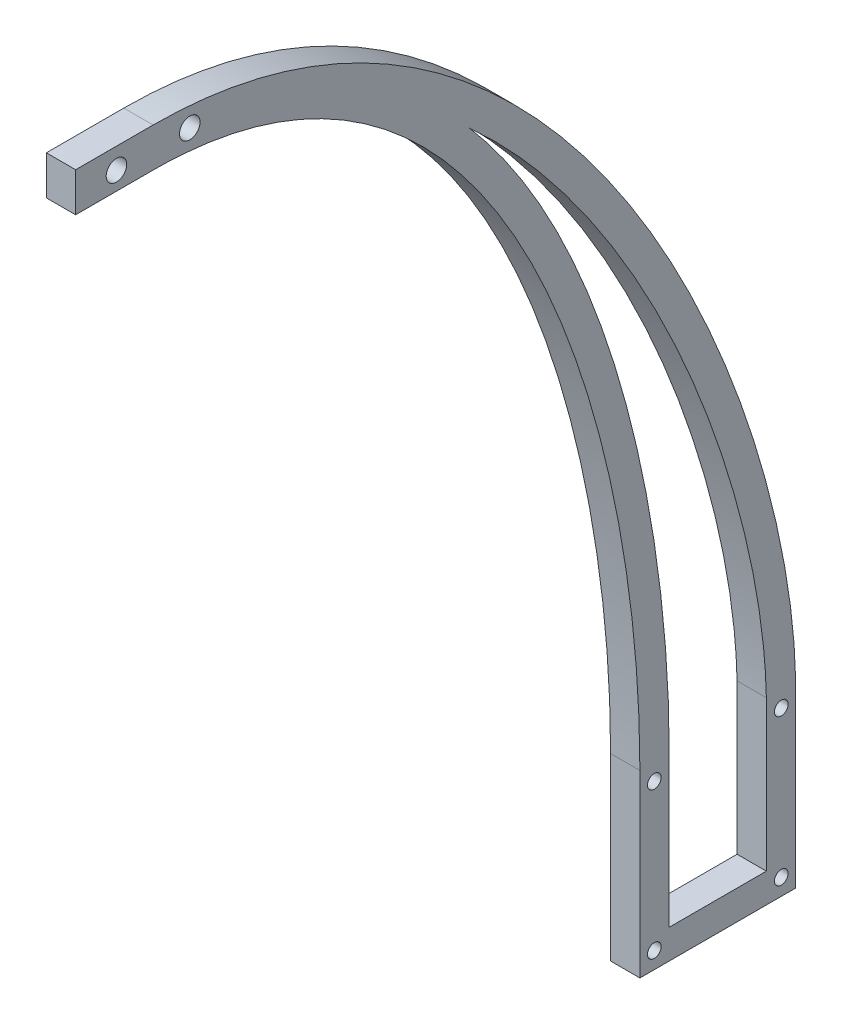
ISO-10303-21;
HEADER;
FILE_DESCRIPTION(('STEP AP214'),'2;1');
FILE_NAME('part.step','',(''),(''),'','','');
FILE_SCHEMA(('AUTOMOTIVE_DESIGN { 1 0 10303 214 1 1 1 1 }'));
ENDSEC;
DATA;
#1=APPLICATION_CONTEXT('core data for automotive mechanical design processes');
#2=APPLICATION_PROTOCOL_DEFINITION('international standard','automotive_design',2000,#1);
#3=PRODUCT_CONTEXT('',#1,'mechanical');
#4=PRODUCT('Part','Part','',(#3));
#5=PRODUCT_RELATED_PRODUCT_CATEGORY('part','',(#4));
#6=PRODUCT_DEFINITION_FORMATION('','',#4);
#7=PRODUCT_DEFINITION_CONTEXT('part definition',#1,'design');
#8=PRODUCT_DEFINITION('design','',#6,#7);
#9=PRODUCT_DEFINITION_SHAPE('','',#8);
#10=(LENGTH_UNIT() NAMED_UNIT(*) SI_UNIT(.MILLI.,.METRE.));
#11=(NAMED_UNIT(*) PLANE_ANGLE_UNIT() SI_UNIT($,.RADIAN.));
#12=(NAMED_UNIT(*) SI_UNIT($,.STERADIAN.) SOLID_ANGLE_UNIT());
#13=UNCERTAINTY_MEASURE_WITH_UNIT(LENGTH_MEASURE(1.E-05),#10,'distance_accuracy_value','');
#14=(GEOMETRIC_REPRESENTATION_CONTEXT(3) GLOBAL_UNCERTAINTY_ASSIGNED_CONTEXT((#13)) GLOBAL_UNIT_ASSIGNED_CONTEXT((#10,
#11,#12)) REPRESENTATION_CONTEXT('',''));
#15=CARTESIAN_POINT('',(0.,0.,0.));
#16=DIRECTION('',(0.,0.,1.));
#17=DIRECTION('',(1.,0.,0.));
#18=AXIS2_PLACEMENT_3D('',#15,#16,#17);
#19=CARTESIAN_POINT('',(-31.,-74.6026285586912,0.));
#20=DIRECTION('',(0.,-1.,0.));
#21=DIRECTION('',(0.,0.,-1.));
#22=AXIS2_PLACEMENT_3D('',#19,#20,#21);
#23=PLANE('',#22);
#24=DIRECTION('',(0.,0.,-1.));
#25=VECTOR('',#24,1.);
#26=CARTESIAN_POINT('',(-25.,-74.6026285586912,0.));
#27=LINE('',#26,#25);
#28=CARTESIAN_POINT('',(-25.,-74.6026285586912,-99.6764669802417));
#29=VERTEX_POINT('',#28);
#30=CARTESIAN_POINT('',(-25.,-74.6026285586912,-131.570211562689));
#31=VERTEX_POINT('',#30);
#32=EDGE_CURVE('E256',#29,#31,#27,.T.);
#33=ORIENTED_EDGE('',*,*,#32,.F.);
#34=DIRECTION('',(1.,0.,0.));
#35=VECTOR('',#34,1.);
#36=CARTESIAN_POINT('',(-31.,-74.6026285586912,-99.6764669802417));
#37=LINE('',#36,#35);
#38=CARTESIAN_POINT('',(-31.,-74.6026285586912,-99.6764669802417));
#39=VERTEX_POINT('',#38);
#40=EDGE_CURVE('E11',#39,#29,#37,.T.);
#41=ORIENTED_EDGE('',*,*,#40,.F.);
#42=DIRECTION('',(0.,0.,-1.));
#43=VECTOR('',#42,1.);
#44=CARTESIAN_POINT('',(-31.,-74.6026285586912,0.));
#45=LINE('',#44,#43);
#46=CARTESIAN_POINT('',(-31.,-74.6026285586912,-131.570211562689));
#47=VERTEX_POINT('',#46);
#48=EDGE_CURVE('E329',#39,#47,#45,.T.);
#49=ORIENTED_EDGE('',*,*,#48,.T.);
#50=DIRECTION('',(1.,0.,0.));
#51=VECTOR('',#50,1.);
#52=CARTESIAN_POINT('',(-31.,-74.6026285586912,-131.570211562689));
#53=LINE('',#52,#51);
#54=EDGE_CURVE('E244',#47,#31,#53,.T.);
#55=ORIENTED_EDGE('',*,*,#54,.T.);
#56=EDGE_LOOP('',(#33,#41,#49,#55));
#57=FACE_BOUND('',#56,.T.);
#58=ADVANCED_FACE('F34',(#57),#23,.T.);
#59=CARTESIAN_POINT('',(-31.,0.,-99.6764669802417));
#60=DIRECTION('',(0.,0.,-1.));
#61=DIRECTION('',(-1.,0.,0.));
#62=AXIS2_PLACEMENT_3D('',#59,#60,#61);
#63=PLANE('',#62);
#64=DIRECTION('',(0.,1.,0.));
#65=VECTOR('',#64,1.);
#66=CARTESIAN_POINT('',(-25.,0.,-99.6764669802417));
#67=LINE('',#66,#65);
#68=CARTESIAN_POINT('',(-25.,-37.8021540404827,-99.6764669802417));
#69=VERTEX_POINT('',#68);
#70=EDGE_CURVE('E259',#29,#69,#67,.T.);
#71=ORIENTED_EDGE('',*,*,#70,.T.);
#72=DIRECTION('',(1.,0.,0.));
#73=VECTOR('',#72,1.);
#74=CARTESIAN_POINT('',(-31.,-37.8021540404827,-99.6764669802417));
#75=LINE('',#74,#73);
#76=CARTESIAN_POINT('',(-31.,-37.8021540404827,-99.6764669802417));
#77=VERTEX_POINT('',#76);
#78=EDGE_CURVE('E45',#77,#69,#75,.T.);
#79=ORIENTED_EDGE('',*,*,#78,.F.);
#80=DIRECTION('',(0.,1.,0.));
#81=VECTOR('',#80,1.);
#82=CARTESIAN_POINT('',(-31.,0.,-99.6764669802417));
#83=LINE('',#82,#81);
#84=EDGE_CURVE('E350',#39,#77,#83,.T.);
#85=ORIENTED_EDGE('',*,*,#84,.F.);
#86=ORIENTED_EDGE('',*,*,#40,.T.);
#87=EDGE_LOOP('',(#71,#79,#85,#86));
#88=FACE_BOUND('',#87,.T.);
#89=ADVANCED_FACE('F320',(#88),#63,.F.);
#90=CARTESIAN_POINT('',(-31.,-37.8021540404827,-99.6764669802417));
#91=CARTESIAN_POINT('',(-31.,25.8867501246922,-99.6764669802417));
#92=CARTESIAN_POINT('',(-31.,118.5,-72.3910283919676));
#93=CARTESIAN_POINT('',(-31.,118.5,0.));
#94=B_SPLINE_CURVE_WITH_KNOTS('',3,(#90,#91,#92,#93),.UNSPECIFIED.,.F.,.F.,(4,4),(0.,1.),.UNSPECIFIED.);
#95=DIRECTION('',(1.,0.,0.));
#96=VECTOR('',#95,1.);
#97=SURFACE_OF_LINEAR_EXTRUSION('',#94,#96);
#98=CARTESIAN_POINT('',(-25.,-37.8021540404827,-99.6764669802417));
#99=CARTESIAN_POINT('',(-25.,25.8867501246922,-99.6764669802417));
#100=CARTESIAN_POINT('',(-25.,118.5,-72.3910283919676));
#101=CARTESIAN_POINT('',(-25.,118.5,0.));
#102=B_SPLINE_CURVE_WITH_KNOTS('',3,(#98,#99,#100,#101),.UNSPECIFIED.,.F.,.F.,(4,4),(0.,1.),.UNSPECIFIED.);
#103=CARTESIAN_POINT('',(-25.,118.5,0.));
#104=VERTEX_POINT('',#103);
#105=EDGE_CURVE('E262',#69,#104,#102,.T.);
#106=ORIENTED_EDGE('',*,*,#105,.T.);
#107=DIRECTION('',(1.,0.,0.));
#108=VECTOR('',#107,1.);
#109=CARTESIAN_POINT('',(-31.,118.5,0.));
#110=LINE('',#109,#108);
#111=CARTESIAN_POINT('',(-31.,118.5,0.));
#112=VERTEX_POINT('',#111);
#113=EDGE_CURVE('E306',#112,#104,#110,.T.);
#114=ORIENTED_EDGE('',*,*,#113,.F.);
#115=EDGE_CURVE('E315',#77,#112,#94,.T.);
#116=ORIENTED_EDGE('',*,*,#115,.F.);
#117=ORIENTED_EDGE('',*,*,#78,.T.);
#118=EDGE_LOOP('',(#106,#114,#116,#117));
#119=FACE_BOUND('',#118,.T.);
#120=ADVANCED_FACE('F312',(#119),#97,.F.);
#121=CARTESIAN_POINT('',(-31.,118.5,0.));
#122=DIRECTION('',(0.,1.,0.));
#123=DIRECTION('',(0.,0.,1.));
#124=AXIS2_PLACEMENT_3D('',#121,#122,#123);
#125=PLANE('',#124);
#126=DIRECTION('',(0.,0.,1.));
#127=VECTOR('',#126,1.);
#128=CARTESIAN_POINT('',(-25.,118.5,0.));
#129=LINE('',#128,#127);
#130=CARTESIAN_POINT('',(-25.,118.5,15.8665640867256));
#131=VERTEX_POINT('',#130);
#132=EDGE_CURVE('E267',#104,#131,#129,.T.);
#133=ORIENTED_EDGE('',*,*,#132,.T.);
#134=DIRECTION('',(1.,0.,0.));
#135=VECTOR('',#134,1.);
#136=CARTESIAN_POINT('',(-31.,118.5,15.8665640867256));
#137=LINE('',#136,#135);
#138=CARTESIAN_POINT('',(-31.,118.5,15.8665640867256));
#139=VERTEX_POINT('',#138);
#140=EDGE_CURVE('E304',#139,#131,#137,.T.);
#141=ORIENTED_EDGE('',*,*,#140,.F.);
#142=DIRECTION('',(0.,0.,1.));
#143=VECTOR('',#142,1.);
#144=CARTESIAN_POINT('',(-31.,118.5,0.));
#145=LINE('',#144,#143);
#146=EDGE_CURVE('E346',#112,#139,#145,.T.);
#147=ORIENTED_EDGE('',*,*,#146,.F.);
#148=ORIENTED_EDGE('',*,*,#113,.T.);
#149=EDGE_LOOP('',(#133,#141,#147,#148));
#150=FACE_BOUND('',#149,.T.);
#151=ADVANCED_FACE('F345',(#150),#125,.F.);
#152=CARTESIAN_POINT('',(-31.,0.,15.8665640867257));
#153=DIRECTION('',(0.,0.,1.));
#154=DIRECTION('',(0.,-1.,0.));
#155=AXIS2_PLACEMENT_3D('',#152,#153,#154);
#156=PLANE('',#155);
#157=DIRECTION('',(0.,-1.,0.));
#158=VECTOR('',#157,1.);
#159=CARTESIAN_POINT('',(-25.,0.,15.8665640867257));
#160=LINE('',#159,#158);
#161=CARTESIAN_POINT('',(-25.,126.5,15.8665640867256));
#162=VERTEX_POINT('',#161);
#163=EDGE_CURVE('E273',#162,#131,#160,.T.);
#164=ORIENTED_EDGE('',*,*,#163,.F.);
#165=DIRECTION('',(1.,0.,0.));
#166=VECTOR('',#165,1.);
#167=CARTESIAN_POINT('',(-31.,126.5,15.8665640867256));
#168=LINE('',#167,#166);
#169=CARTESIAN_POINT('',(-31.,126.5,15.8665640867256));
#170=VERTEX_POINT('',#169);
#171=EDGE_CURVE('E302',#170,#162,#168,.T.);
#172=ORIENTED_EDGE('',*,*,#171,.F.);
#173=DIRECTION('',(0.,-1.,0.));
#174=VECTOR('',#173,1.);
#175=CARTESIAN_POINT('',(-31.,0.,15.8665640867257));
#176=LINE('',#175,#174);
#177=EDGE_CURVE('E343',#170,#139,#176,.T.);
#178=ORIENTED_EDGE('',*,*,#177,.T.);
#179=ORIENTED_EDGE('',*,*,#140,.T.);
#180=EDGE_LOOP('',(#164,#172,#178,#179));
#181=FACE_BOUND('',#180,.T.);
#182=ADVANCED_FACE('F339',(#181),#156,.T.);
#183=CARTESIAN_POINT('',(-31.,126.5,0.));
#184=DIRECTION('',(0.,1.,0.));
#185=DIRECTION('',(0.,0.,1.));
#186=AXIS2_PLACEMENT_3D('',#183,#184,#185);
#187=PLANE('',#186);
#188=DIRECTION('',(0.,0.,1.));
#189=VECTOR('',#188,1.);
#190=CARTESIAN_POINT('',(-25.,126.5,0.));
#191=LINE('',#190,#189);
#192=CARTESIAN_POINT('',(-25.,126.5,0.));
#193=VERTEX_POINT('',#192);
#194=EDGE_CURVE('E276',#193,#162,#191,.T.);
#195=ORIENTED_EDGE('',*,*,#194,.F.);
#196=DIRECTION('',(1.,0.,0.));
#197=VECTOR('',#196,1.);
#198=CARTESIAN_POINT('',(-31.,126.5,0.));
#199=LINE('',#198,#197);
#200=CARTESIAN_POINT('',(-31.,126.5,0.));
#201=VERTEX_POINT('',#200);
#202=EDGE_CURVE('E300',#201,#193,#199,.T.);
#203=ORIENTED_EDGE('',*,*,#202,.F.);
#204=DIRECTION('',(0.,0.,1.));
#205=VECTOR('',#204,1.);
#206=CARTESIAN_POINT('',(-31.,126.5,0.));
#207=LINE('',#206,#205);
#208=EDGE_CURVE('E232',#201,#170,#207,.T.);
#209=ORIENTED_EDGE('',*,*,#208,.T.);
#210=ORIENTED_EDGE('',*,*,#171,.T.);
#211=EDGE_LOOP('',(#195,#203,#209,#210));
#212=FACE_BOUND('',#211,.T.);
#213=ADVANCED_FACE('F221',(#212),#187,.T.);
#214=CARTESIAN_POINT('',(-31.,-37.8021540404827,-131.570211562689));
#215=CARTESIAN_POINT('',(-31.,18.488598382336,-130.468226092805));
#216=CARTESIAN_POINT('',(-31.,126.5,-82.518343245907));
#217=CARTESIAN_POINT('',(-31.,126.5,0.));
#218=B_SPLINE_CURVE_WITH_KNOTS('',3,(#214,#215,#216,#217),.UNSPECIFIED.,.F.,.F.,(4,4),(0.,1.),.UNSPECIFIED.);
#219=DIRECTION('',(1.,0.,0.));
#220=VECTOR('',#219,1.);
#221=SURFACE_OF_LINEAR_EXTRUSION('',#218,#220);
#222=CARTESIAN_POINT('',(-25.,-37.8021540404827,-131.570211562689));
#223=CARTESIAN_POINT('',(-25.,18.488598382336,-130.468226092805));
#224=CARTESIAN_POINT('',(-25.,126.5,-82.518343245907));
#225=CARTESIAN_POINT('',(-25.,126.5,0.));
#226=B_SPLINE_CURVE_WITH_KNOTS('',3,(#222,#223,#224,#225),.UNSPECIFIED.,.F.,.F.,(4,4),(0.,1.),.UNSPECIFIED.);
#227=CARTESIAN_POINT('',(-25.,-37.8021540404827,-131.570211562689));
#228=VERTEX_POINT('',#227);
#229=EDGE_CURVE('E279',#228,#193,#226,.T.);
#230=ORIENTED_EDGE('',*,*,#229,.F.);
#231=DIRECTION('',(1.,0.,0.));
#232=VECTOR('',#231,1.);
#233=CARTESIAN_POINT('',(-31.,-37.8021540404827,-131.570211562689));
#234=LINE('',#233,#232);
#235=CARTESIAN_POINT('',(-31.,-37.8021540404827,-131.570211562689));
#236=VERTEX_POINT('',#235);
#237=EDGE_CURVE('E298',#236,#228,#234,.T.);
#238=ORIENTED_EDGE('',*,*,#237,.F.);
#239=EDGE_CURVE('E224',#236,#201,#218,.T.);
#240=ORIENTED_EDGE('',*,*,#239,.T.);
#241=ORIENTED_EDGE('',*,*,#202,.T.);
#242=EDGE_LOOP('',(#230,#238,#240,#241));
#243=FACE_BOUND('',#242,.T.);
#244=ADVANCED_FACE('F212',(#243),#221,.T.);
#245=CARTESIAN_POINT('',(-31.,122.225596062464,-7.50848665157555));
#246=DIRECTION('',(1.,0.,0.));
#247=DIRECTION('',(0.,0.,-1.));
#248=AXIS2_PLACEMENT_3D('',#245,#246,#247);
#249=CYLINDRICAL_SURFACE('',#248,2.09999999999999);
#250=CARTESIAN_POINT('',(-31.,122.225596062464,-7.50848665157555));
#251=DIRECTION('',(-1.,0.,0.));
#252=DIRECTION('',(0.,0.,1.));
#253=AXIS2_PLACEMENT_3D('',#250,#251,#252);
#254=CIRCLE('',#253,2.09999999999999);
#255=CARTESIAN_POINT('',(-31.,122.225596062464,-5.40848665157556));
#256=VERTEX_POINT('',#255);
#257=EDGE_CURVE('E238',#256,#256,#254,.T.);
#258=ORIENTED_EDGE('',*,*,#257,.T.);
#259=EDGE_LOOP('',(#258));
#260=FACE_BOUND('',#259,.T.);
#261=CARTESIAN_POINT('',(-25.,122.225596062464,-7.50848665157555));
#262=DIRECTION('',(-1.,0.,0.));
#263=DIRECTION('',(0.,0.,1.));
#264=AXIS2_PLACEMENT_3D('',#261,#262,#263);
#265=CIRCLE('',#264,2.09999999999999);
#266=CARTESIAN_POINT('',(-25.,122.225596062464,-5.40848665157556));
#267=VERTEX_POINT('',#266);
#268=EDGE_CURVE('E290',#267,#267,#265,.T.);
#269=ORIENTED_EDGE('',*,*,#268,.F.);
#270=EDGE_LOOP('',(#269));
#271=FACE_BOUND('',#270,.T.);
#272=ADVANCED_FACE('F208',(#260,#271),#249,.F.);
#273=CARTESIAN_POINT('',(-31.,0.,-131.570211562689));
#274=DIRECTION('',(0.,0.,1.));
#275=DIRECTION('',(1.,0.,0.));
#276=AXIS2_PLACEMENT_3D('',#273,#274,#275);
#277=PLANE('',#276);
#278=DIRECTION('',(0.,-1.,0.));
#279=VECTOR('',#278,1.);
#280=CARTESIAN_POINT('',(-25.,0.,-131.570211562689));
#281=LINE('',#280,#279);
#282=EDGE_CURVE('E284',#228,#31,#281,.T.);
#283=ORIENTED_EDGE('',*,*,#282,.T.);
#284=ORIENTED_EDGE('',*,*,#54,.F.);
#285=DIRECTION('',(0.,-1.,0.));
#286=VECTOR('',#285,1.);
#287=CARTESIAN_POINT('',(-31.,0.,-131.570211562689));
#288=LINE('',#287,#286);
#289=EDGE_CURVE('E231',#236,#47,#288,.T.);
#290=ORIENTED_EDGE('',*,*,#289,.F.);
#291=ORIENTED_EDGE('',*,*,#237,.T.);
#292=EDGE_LOOP('',(#283,#284,#290,#291));
#293=FACE_BOUND('',#292,.T.);
#294=ADVANCED_FACE('F211',(#293),#277,.F.);
#295=CARTESIAN_POINT('',(-31.,-41.2023912995869,-128.623339271465));
#296=DIRECTION('',(1.,0.,0.));
#297=DIRECTION('',(0.,0.,-1.));
#298=AXIS2_PLACEMENT_3D('',#295,#296,#297);
#299=CYLINDRICAL_SURFACE('',#298,1.4);
#300=CARTESIAN_POINT('',(-31.,-41.2023912995869,-128.623339271465));
#301=DIRECTION('',(-1.,0.,0.));
#302=DIRECTION('',(0.,0.,1.));
#303=AXIS2_PLACEMENT_3D('',#300,#301,#302);
#304=CIRCLE('',#303,1.4);
#305=CARTESIAN_POINT('',(-31.,-41.2023912995869,-127.223339271465));
#306=VERTEX_POINT('',#305);
#307=EDGE_CURVE('E397',#306,#306,#304,.F.);
#308=ORIENTED_EDGE('',*,*,#307,.F.);
#309=EDGE_LOOP('',(#308));
#310=FACE_BOUND('',#309,.T.);
#311=CARTESIAN_POINT('',(-25.,-41.2023912995869,-128.623339271465));
#312=DIRECTION('',(-1.,0.,0.));
#313=DIRECTION('',(0.,0.,1.));
#314=AXIS2_PLACEMENT_3D('',#311,#312,#313);
#315=CIRCLE('',#314,1.4);
#316=CARTESIAN_POINT('',(-25.,-41.2023912995869,-127.223339271465));
#317=VERTEX_POINT('',#316);
#318=EDGE_CURVE('E253',#317,#317,#315,.F.);
#319=ORIENTED_EDGE('',*,*,#318,.T.);
#320=EDGE_LOOP('',(#319));
#321=FACE_BOUND('',#320,.T.);
#322=ADVANCED_FACE('F216',(#310,#321),#299,.F.);
#323=CARTESIAN_POINT('',(-31.,-41.2023912995869,-102.623339271465));
#324=DIRECTION('',(1.,0.,0.));
#325=DIRECTION('',(0.,0.,-1.));
#326=AXIS2_PLACEMENT_3D('',#323,#324,#325);
#327=CYLINDRICAL_SURFACE('',#326,1.4);
#328=CARTESIAN_POINT('',(-31.,-41.2023912995869,-102.623339271465));
#329=DIRECTION('',(-1.,0.,0.));
#330=DIRECTION('',(0.,0.,1.));
#331=AXIS2_PLACEMENT_3D('',#328,#329,#330);
#332=CIRCLE('',#331,1.4);
#333=CARTESIAN_POINT('',(-31.,-41.2023912995869,-101.223339271465));
#334=VERTEX_POINT('',#333);
#335=EDGE_CURVE('E394',#334,#334,#332,.F.);
#336=ORIENTED_EDGE('',*,*,#335,.F.);
#337=EDGE_LOOP('',(#336));
#338=FACE_BOUND('',#337,.T.);
#339=CARTESIAN_POINT('',(-25.,-41.2023912995869,-102.623339271465));
#340=DIRECTION('',(-1.,0.,0.));
#341=DIRECTION('',(0.,0.,1.));
#342=AXIS2_PLACEMENT_3D('',#339,#340,#341);
#343=CIRCLE('',#342,1.4);
#344=CARTESIAN_POINT('',(-25.,-41.2023912995869,-101.223339271465));
#345=VERTEX_POINT('',#344);
#346=EDGE_CURVE('E250',#345,#345,#343,.F.);
#347=ORIENTED_EDGE('',*,*,#346,.T.);
#348=EDGE_LOOP('',(#347));
#349=FACE_BOUND('',#348,.T.);
#350=ADVANCED_FACE('F370',(#338,#349),#327,.F.);
#351=CARTESIAN_POINT('',(-31.,-71.2023912995869,-102.623339271465));
#352=DIRECTION('',(1.,0.,0.));
#353=DIRECTION('',(0.,0.,-1.));
#354=AXIS2_PLACEMENT_3D('',#351,#352,#353);
#355=CYLINDRICAL_SURFACE('',#354,1.4);
#356=CARTESIAN_POINT('',(-31.,-71.2023912995869,-102.623339271465));
#357=DIRECTION('',(-1.,0.,0.));
#358=DIRECTION('',(0.,0.,1.));
#359=AXIS2_PLACEMENT_3D('',#356,#357,#358);
#360=CIRCLE('',#359,1.4);
#361=CARTESIAN_POINT('',(-31.,-71.2023912995869,-101.223339271465));
#362=VERTEX_POINT('',#361);
#363=EDGE_CURVE('E384',#362,#362,#360,.F.);
#364=ORIENTED_EDGE('',*,*,#363,.F.);
#365=EDGE_LOOP('',(#364));
#366=FACE_BOUND('',#365,.T.);
#367=CARTESIAN_POINT('',(-25.,-71.2023912995869,-102.623339271465));
#368=DIRECTION('',(-1.,0.,0.));
#369=DIRECTION('',(0.,0.,1.));
#370=AXIS2_PLACEMENT_3D('',#367,#368,#369);
#371=CIRCLE('',#370,1.4);
#372=CARTESIAN_POINT('',(-25.,-71.2023912995869,-101.223339271465));
#373=VERTEX_POINT('',#372);
#374=EDGE_CURVE('E247',#373,#373,#371,.F.);
#375=ORIENTED_EDGE('',*,*,#374,.T.);
#376=EDGE_LOOP('',(#375));
#377=FACE_BOUND('',#376,.T.);
#378=ADVANCED_FACE('F373',(#366,#377),#355,.F.);
#379=CARTESIAN_POINT('',(-31.,-71.2023912995869,-128.623339271465));
#380=DIRECTION('',(1.,0.,0.));
#381=DIRECTION('',(0.,0.,-1.));
#382=AXIS2_PLACEMENT_3D('',#379,#380,#381);
#383=CYLINDRICAL_SURFACE('',#382,1.4);
#384=CARTESIAN_POINT('',(-31.,-71.2023912995869,-128.623339271465));
#385=DIRECTION('',(-1.,0.,0.));
#386=DIRECTION('',(0.,0.,1.));
#387=AXIS2_PLACEMENT_3D('',#384,#385,#386);
#388=CIRCLE('',#387,1.4);
#389=CARTESIAN_POINT('',(-31.,-71.2023912995869,-127.223339271465));
#390=VERTEX_POINT('',#389);
#391=EDGE_CURVE('E296',#390,#390,#388,.F.);
#392=ORIENTED_EDGE('',*,*,#391,.F.);
#393=EDGE_LOOP('',(#392));
#394=FACE_BOUND('',#393,.T.);
#395=CARTESIAN_POINT('',(-25.,-71.2023912995869,-128.623339271465));
#396=DIRECTION('',(-1.,0.,0.));
#397=DIRECTION('',(0.,0.,1.));
#398=AXIS2_PLACEMENT_3D('',#395,#396,#397);
#399=CIRCLE('',#398,1.4);
#400=CARTESIAN_POINT('',(-25.,-71.2023912995869,-127.223339271465));
#401=VERTEX_POINT('',#400);
#402=EDGE_CURVE('E166',#401,#401,#399,.F.);
#403=ORIENTED_EDGE('',*,*,#402,.T.);
#404=EDGE_LOOP('',(#403));
#405=FACE_BOUND('',#404,.T.);
#406=ADVANCED_FACE('F36',(#394,#405),#383,.F.);
#407=CARTESIAN_POINT('',(-31.,122.225596062464,7.50848665157556));
#408=DIRECTION('',(1.,0.,0.));
#409=DIRECTION('',(0.,0.,-1.));
#410=AXIS2_PLACEMENT_3D('',#407,#408,#409);
#411=CYLINDRICAL_SURFACE('',#410,2.09999999999998);
#412=CARTESIAN_POINT('',(-31.,122.225596062464,7.50848665157556));
#413=DIRECTION('',(-1.,0.,0.));
#414=DIRECTION('',(0.,0.,1.));
#415=AXIS2_PLACEMENT_3D('',#412,#413,#414);
#416=CIRCLE('',#415,2.09999999999998);
#417=CARTESIAN_POINT('',(-31.,122.225596062464,9.60848665157554));
#418=VERTEX_POINT('',#417);
#419=EDGE_CURVE('E241',#418,#418,#416,.F.);
#420=ORIENTED_EDGE('',*,*,#419,.F.);
#421=EDGE_LOOP('',(#420));
#422=FACE_BOUND('',#421,.T.);
#423=CARTESIAN_POINT('',(-25.,122.225596062464,7.50848665157555));
#424=DIRECTION('',(-1.,0.,0.));
#425=DIRECTION('',(0.,0.,1.));
#426=AXIS2_PLACEMENT_3D('',#423,#424,#425);
#427=CIRCLE('',#426,2.09999999999998);
#428=CARTESIAN_POINT('',(-25.,122.225596062464,9.60848665157554));
#429=VERTEX_POINT('',#428);
#430=EDGE_CURVE('E293',#429,#429,#427,.F.);
#431=ORIENTED_EDGE('',*,*,#430,.T.);
#432=EDGE_LOOP('',(#431));
#433=FACE_BOUND('',#432,.T.);
#434=ADVANCED_FACE('F198',(#422,#433),#411,.F.);
#435=CARTESIAN_POINT('',(-31.,0.,0.));
#436=DIRECTION('',(-1.,0.,0.));
#437=DIRECTION('',(0.,0.,1.));
#438=AXIS2_PLACEMENT_3D('',#435,#436,#437);
#439=PLANE('',#438);
#440=DIRECTION('',(0.,-1.,0.));
#441=VECTOR('',#440,1.);
#442=CARTESIAN_POINT('',(-31.,-37.8617523249985,-125.570211562689));
#443=LINE('',#442,#441);
#444=CARTESIAN_POINT('',(-31.,-37.8617523249985,-125.570211562689));
#445=VERTEX_POINT('',#444);
#446=CARTESIAN_POINT('',(-31.,-68.6026285586912,-125.570211562689));
#447=VERTEX_POINT('',#446);
#448=EDGE_CURVE('E53',#445,#447,#443,.T.);
#449=ORIENTED_EDGE('',*,*,#448,.F.);
#450=CARTESIAN_POINT('',(-31.,93.5793103858169,-64.7547274979471));
#451=CARTESIAN_POINT('',(-31.,89.437140635182,-69.3446426386855));
#452=CARTESIAN_POINT('',(-31.,85.0040784065932,-73.6211882014054));
#453=CARTESIAN_POINT('',(-31.,75.6614805591216,-81.6609891025541));
#454=CARTESIAN_POINT('',(-31.,70.7512424527392,-85.4234876726649));
#455=CARTESIAN_POINT('',(-31.,63.0721823353876,-90.7292929168928));
#456=CARTESIAN_POINT('',(-31.,60.4762505718133,-92.429915520262));
#457=CARTESIAN_POINT('',(-31.,55.2284359231289,-95.6993554795856));
#458=CARTESIAN_POINT('',(-31.,52.5747405120427,-97.2693959704238));
#459=CARTESIAN_POINT('',(-31.,44.5301446024464,-101.798191155563));
#460=CARTESIAN_POINT('',(-31.,39.0562896044043,-104.576825029367));
#461=CARTESIAN_POINT('',(-31.,27.9032907932721,-109.688344927087));
#462=CARTESIAN_POINT('',(-31.,22.2242019946561,-112.021350405067));
#463=CARTESIAN_POINT('',(-31.,13.5498597716193,-115.182764395441));
#464=CARTESIAN_POINT('',(-31.,10.6323153042127,-116.179903973374));
#465=CARTESIAN_POINT('',(-31.,4.74253027927283,-118.055420377525));
#466=CARTESIAN_POINT('',(-31.,1.76847276394112,-118.93435352093));
#467=CARTESIAN_POINT('',(-31.,-4.23123799376611,-120.561387840647));
#468=CARTESIAN_POINT('',(-31.,-7.24220621304247,-121.30563948277));
#469=CARTESIAN_POINT('',(-31.,-13.2883809472461,-122.643067251359));
#470=CARTESIAN_POINT('',(-31.,-16.3235599008485,-123.236415165538));
#471=CARTESIAN_POINT('',(-31.,-22.4217057958491,-124.249910507946));
#472=CARTESIAN_POINT('',(-31.,-25.4846070192902,-124.670467551373));
#473=CARTESIAN_POINT('',(-31.,-31.6445870328842,-125.298555376428));
#474=CARTESIAN_POINT('',(-31.,-34.7414740109845,-125.507281708485));
#475=CARTESIAN_POINT('',(-31.,-37.8617523249985,-125.570211562689));
#476=B_SPLINE_CURVE_WITH_KNOTS('',3,(#450,#451,#452,#453,#454,#455,#456,#457,#458,#459,#460,
#461,#462,#463,#464,#465,#466,#467,#468,#469,#470,#471,#472,#473,#474,#475),.UNSPECIFIED.,.F.,
.F.,(4,2,2,2,2,2,2,2,2,2,2,2,4),(0.,0.125,0.25,0.3125,0.375,0.499999999999999,0.624999999999999,
0.687499999999999,0.749999999999999,0.8125,0.875,0.9375,1.),.UNSPECIFIED.);
#477=CARTESIAN_POINT('',(-31.,93.5793103858141,-64.7547274979441));
#478=VERTEX_POINT('',#477);
#479=EDGE_CURVE('E155',#478,#445,#476,.T.);
#480=ORIENTED_EDGE('',*,*,#479,.F.);
#481=CARTESIAN_POINT('',(-31.,-37.8021540404827,-105.676466980242));
#482=CARTESIAN_POINT('',(-31.,-31.9240793188836,-105.676466980242));
#483=CARTESIAN_POINT('',(-31.,-26.0799910885763,-105.452997771788));
#484=CARTESIAN_POINT('',(-31.,-14.4505616784568,-104.619783620782));
#485=CARTESIAN_POINT('',(-31.,-8.66535950711611,-104.009124664693));
#486=CARTESIAN_POINT('',(-31.,2.84811727114483,-102.413494569154));
#487=CARTESIAN_POINT('',(-31.,8.5763592269729,-101.428308741059));
#488=CARTESIAN_POINT('',(-31.,19.9732000108138,-99.0657694307221));
#489=CARTESIAN_POINT('',(-31.,25.6418211341061,-97.688562545209));
#490=CARTESIAN_POINT('',(-31.,32.6858039033916,-95.6922509169155));
#491=CARTESIAN_POINT('',(-31.,34.0924981691949,-95.2791655507056));
#492=CARTESIAN_POINT('',(-31.,36.9015141469101,-94.4242442435749));
#493=CARTESIAN_POINT('',(-31.,38.304756274972,-93.9820857884453));
#494=CARTESIAN_POINT('',(-31.,42.4929570351154,-92.6154974800185));
#495=CARTESIAN_POINT('',(-31.,45.2604337675035,-91.6498760550427));
#496=CARTESIAN_POINT('',(-31.,53.4839643589421,-88.5784185575111));
#497=CARTESIAN_POINT('',(-31.,58.8617621816539,-86.2994133867463));
#498=CARTESIAN_POINT('',(-31.,66.7421300349821,-82.468587223514));
#499=CARTESIAN_POINT('',(-31.,69.3377198337945,-81.1226052963474));
#500=CARTESIAN_POINT('',(-31.,73.1789230748339,-78.9881625159158));
#501=CARTESIAN_POINT('',(-31.,74.4506133294794,-78.2574058130517));
#502=CARTESIAN_POINT('',(-31.,76.9754816025187,-76.7549275513522));
#503=CARTESIAN_POINT('',(-31.,78.2297838450036,-75.9824872606619));
#504=CARTESIAN_POINT('',(-31.,84.4394469386038,-72.0189563000988));
#505=CARTESIAN_POINT('',(-31.,89.158670697475,-68.5599617690091));
#506=CARTESIAN_POINT('',(-31.,93.5793103858141,-64.7547274979441));
#507=B_SPLINE_CURVE_WITH_KNOTS('',3,(#481,#482,#483,#484,#485,#486,#487,#488,#489,#490,#491,
#492,#493,#494,#495,#496,#497,#498,#499,#500,#501,#502,#503,#504,#505,#506),.UNSPECIFIED.,.F.,
.F.,(4,2,2,2,2,2,2,2,2,2,2,2,4),(0.,0.125,0.25,0.375,0.500000000000001,0.531250000000001,
0.562500000000001,0.625000000000001,0.750000000000001,0.812500000000001,0.843750000000001,0.875,
1.),.UNSPECIFIED.);
#508=CARTESIAN_POINT('',(-31.,-37.8021540404827,-105.676466980242));
#509=VERTEX_POINT('',#508);
#510=EDGE_CURVE('E152',#509,#478,#507,.T.);
#511=ORIENTED_EDGE('',*,*,#510,.F.);
#512=DIRECTION('',(0.,1.,0.));
#513=VECTOR('',#512,1.);
#514=CARTESIAN_POINT('',(-31.,-68.6026285586912,-105.676466980242));
#515=LINE('',#514,#513);
#516=CARTESIAN_POINT('',(-31.,-68.6026285586912,-105.676466980242));
#517=VERTEX_POINT('',#516);
#518=EDGE_CURVE('E135',#517,#509,#515,.T.);
#519=ORIENTED_EDGE('',*,*,#518,.F.);
#520=DIRECTION('',(0.,0.,1.));
#521=VECTOR('',#520,1.);
#522=CARTESIAN_POINT('',(-31.,-68.6026285586912,-125.570211562689));
#523=LINE('',#522,#521);
#524=EDGE_CURVE('E144',#447,#517,#523,.T.);
#525=ORIENTED_EDGE('',*,*,#524,.F.);
#526=EDGE_LOOP('',(#449,#480,#511,#519,#525));
#527=FACE_BOUND('',#526,.T.);
#528=ORIENTED_EDGE('',*,*,#391,.T.);
#529=EDGE_LOOP('',(#528));
#530=FACE_BOUND('',#529,.T.);
#531=ORIENTED_EDGE('',*,*,#363,.T.);
#532=EDGE_LOOP('',(#531));
#533=FACE_BOUND('',#532,.T.);
#534=ORIENTED_EDGE('',*,*,#335,.T.);
#535=EDGE_LOOP('',(#534));
#536=FACE_BOUND('',#535,.T.);
#537=ORIENTED_EDGE('',*,*,#307,.T.);
#538=EDGE_LOOP('',(#537));
#539=FACE_BOUND('',#538,.T.);
#540=ORIENTED_EDGE('',*,*,#48,.F.);
#541=ORIENTED_EDGE('',*,*,#84,.T.);
#542=ORIENTED_EDGE('',*,*,#115,.T.);
#543=ORIENTED_EDGE('',*,*,#146,.T.);
#544=ORIENTED_EDGE('',*,*,#177,.F.);
#545=ORIENTED_EDGE('',*,*,#208,.F.);
#546=ORIENTED_EDGE('',*,*,#239,.F.);
#547=ORIENTED_EDGE('',*,*,#289,.T.);
#548=EDGE_LOOP('',(#540,#541,#542,#543,#544,#545,#546,#547));
#549=FACE_BOUND('',#548,.T.);
#550=ORIENTED_EDGE('',*,*,#257,.F.);
#551=EDGE_LOOP('',(#550));
#552=FACE_BOUND('',#551,.T.);
#553=ORIENTED_EDGE('',*,*,#419,.T.);
#554=EDGE_LOOP('',(#553));
#555=FACE_BOUND('',#554,.T.);
#556=ADVANCED_FACE('F148',(#527,#530,#533,#536,#539,#549,#552,#555),#439,.T.);
#557=CARTESIAN_POINT('',(-25.,0.,0.));
#558=DIRECTION('',(-1.,0.,0.));
#559=DIRECTION('',(0.,0.,1.));
#560=AXIS2_PLACEMENT_3D('',#557,#558,#559);
#561=PLANE('',#560);
#562=CARTESIAN_POINT('',(-25.,93.5793103858169,-64.7547274979471));
#563=CARTESIAN_POINT('',(-25.,89.437140635182,-69.3446426386855));
#564=CARTESIAN_POINT('',(-25.,85.0040784065932,-73.6211882014054));
#565=CARTESIAN_POINT('',(-25.,75.6614805591216,-81.6609891025541));
#566=CARTESIAN_POINT('',(-25.,70.7512424527392,-85.4234876726649));
#567=CARTESIAN_POINT('',(-25.,63.0721823353876,-90.7292929168928));
#568=CARTESIAN_POINT('',(-25.,60.4762505718133,-92.429915520262));
#569=CARTESIAN_POINT('',(-25.,55.2284359231289,-95.6993554795856));
#570=CARTESIAN_POINT('',(-25.,52.5747405120427,-97.2693959704238));
#571=CARTESIAN_POINT('',(-25.,44.5301446024464,-101.798191155563));
#572=CARTESIAN_POINT('',(-25.,39.0562896044043,-104.576825029367));
#573=CARTESIAN_POINT('',(-25.,27.9032907932721,-109.688344927087));
#574=CARTESIAN_POINT('',(-25.,22.2242019946561,-112.021350405067));
#575=CARTESIAN_POINT('',(-25.,13.5498597716193,-115.182764395441));
#576=CARTESIAN_POINT('',(-25.,10.6323153042127,-116.179903973374));
#577=CARTESIAN_POINT('',(-25.,4.74253027927283,-118.055420377525));
#578=CARTESIAN_POINT('',(-25.,1.76847276394112,-118.93435352093));
#579=CARTESIAN_POINT('',(-25.,-4.23123799376611,-120.561387840647));
#580=CARTESIAN_POINT('',(-25.,-7.24220621304247,-121.30563948277));
#581=CARTESIAN_POINT('',(-25.,-13.2883809472461,-122.643067251359));
#582=CARTESIAN_POINT('',(-25.,-16.3235599008485,-123.236415165538));
#583=CARTESIAN_POINT('',(-25.,-22.4217057958491,-124.249910507946));
#584=CARTESIAN_POINT('',(-25.,-25.4846070192902,-124.670467551373));
#585=CARTESIAN_POINT('',(-25.,-31.6445870328842,-125.298555376428));
#586=CARTESIAN_POINT('',(-25.,-34.7414740109845,-125.507281708485));
#587=CARTESIAN_POINT('',(-25.,-37.8617523249985,-125.570211562689));
#588=B_SPLINE_CURVE_WITH_KNOTS('',3,(#562,#563,#564,#565,#566,#567,#568,#569,#570,#571,#572,
#573,#574,#575,#576,#577,#578,#579,#580,#581,#582,#583,#584,#585,#586,#587),.UNSPECIFIED.,.F.,
.F.,(4,2,2,2,2,2,2,2,2,2,2,2,4),(0.,0.125,0.25,0.3125,0.375,0.499999999999999,0.624999999999999,
0.687499999999999,0.749999999999999,0.8125,0.875,0.9375,1.),.UNSPECIFIED.);
#589=CARTESIAN_POINT('',(-25.,-37.8617523249985,-125.570211562689));
#590=VERTEX_POINT('',#589);
#591=CARTESIAN_POINT('',(-25.,93.5793103858141,-64.7547274979441));
#592=VERTEX_POINT('',#591);
#593=EDGE_CURVE('E440',#590,#592,#588,.F.);
#594=ORIENTED_EDGE('',*,*,#593,.F.);
#595=DIRECTION('',(0.,1.,0.));
#596=VECTOR('',#595,1.);
#597=CARTESIAN_POINT('',(-25.,-37.8617523249985,-125.570211562689));
#598=LINE('',#597,#596);
#599=CARTESIAN_POINT('',(-25.,-68.6026285586912,-125.570211562689));
#600=VERTEX_POINT('',#599);
#601=EDGE_CURVE('E167',#600,#590,#598,.T.);
#602=ORIENTED_EDGE('',*,*,#601,.F.);
#603=DIRECTION('',(0.,0.,-1.));
#604=VECTOR('',#603,1.);
#605=CARTESIAN_POINT('',(-25.,-68.6026285586912,-125.570211562689));
#606=LINE('',#605,#604);
#607=CARTESIAN_POINT('',(-25.,-68.6026285586912,-105.676466980242));
#608=VERTEX_POINT('',#607);
#609=EDGE_CURVE('E164',#608,#600,#606,.T.);
#610=ORIENTED_EDGE('',*,*,#609,.F.);
#611=DIRECTION('',(0.,-1.,0.));
#612=VECTOR('',#611,1.);
#613=CARTESIAN_POINT('',(-25.,-68.6026285586912,-105.676466980242));
#614=LINE('',#613,#612);
#615=CARTESIAN_POINT('',(-25.,-37.8021540404827,-105.676466980242));
#616=VERTEX_POINT('',#615);
#617=EDGE_CURVE('E138',#616,#608,#614,.T.);
#618=ORIENTED_EDGE('',*,*,#617,.F.);
#619=CARTESIAN_POINT('',(-25.,-37.8021540404827,-105.676466980242));
#620=CARTESIAN_POINT('',(-25.,-31.9240793188836,-105.676466980242));
#621=CARTESIAN_POINT('',(-25.,-26.0799910885763,-105.452997771788));
#622=CARTESIAN_POINT('',(-25.,-14.4505616784568,-104.619783620782));
#623=CARTESIAN_POINT('',(-25.,-8.66535950711611,-104.009124664693));
#624=CARTESIAN_POINT('',(-25.,2.84811727114483,-102.413494569154));
#625=CARTESIAN_POINT('',(-25.,8.5763592269729,-101.428308741059));
#626=CARTESIAN_POINT('',(-25.,19.9732000108138,-99.0657694307221));
#627=CARTESIAN_POINT('',(-25.,25.6418211341061,-97.688562545209));
#628=CARTESIAN_POINT('',(-25.,32.6858039033916,-95.6922509169155));
#629=CARTESIAN_POINT('',(-25.,34.0924981691949,-95.2791655507056));
#630=CARTESIAN_POINT('',(-25.,36.9015141469101,-94.4242442435749));
#631=CARTESIAN_POINT('',(-25.,38.304756274972,-93.9820857884453));
#632=CARTESIAN_POINT('',(-25.,42.4929570351154,-92.6154974800185));
#633=CARTESIAN_POINT('',(-25.,45.2604337675035,-91.6498760550427));
#634=CARTESIAN_POINT('',(-25.,53.4839643589421,-88.5784185575111));
#635=CARTESIAN_POINT('',(-25.,58.8617621816539,-86.2994133867463));
#636=CARTESIAN_POINT('',(-25.,66.7421300349821,-82.468587223514));
#637=CARTESIAN_POINT('',(-25.,69.3377198337945,-81.1226052963474));
#638=CARTESIAN_POINT('',(-25.,73.1789230748339,-78.9881625159158));
#639=CARTESIAN_POINT('',(-25.,74.4506133294794,-78.2574058130517));
#640=CARTESIAN_POINT('',(-25.,76.9754816025187,-76.7549275513522));
#641=CARTESIAN_POINT('',(-25.,78.2297838450036,-75.9824872606619));
#642=CARTESIAN_POINT('',(-25.,84.4394469386038,-72.0189563000988));
#643=CARTESIAN_POINT('',(-25.,89.158670697475,-68.5599617690091));
#644=CARTESIAN_POINT('',(-25.,93.5793103858141,-64.7547274979441));
#645=B_SPLINE_CURVE_WITH_KNOTS('',3,(#619,#620,#621,#622,#623,#624,#625,#626,#627,#628,#629,
#630,#631,#632,#633,#634,#635,#636,#637,#638,#639,#640,#641,#642,#643,#644),.UNSPECIFIED.,.F.,
.F.,(4,2,2,2,2,2,2,2,2,2,2,2,4),(0.,0.125,0.25,0.375,0.500000000000001,0.531250000000001,
0.562500000000001,0.625000000000001,0.750000000000001,0.812500000000001,0.843750000000001,0.875,
1.),.UNSPECIFIED.);
#646=EDGE_CURVE('E444',#592,#616,#645,.F.);
#647=ORIENTED_EDGE('',*,*,#646,.F.);
#648=EDGE_LOOP('',(#594,#602,#610,#618,#647));
#649=FACE_BOUND('',#648,.T.);
#650=ORIENTED_EDGE('',*,*,#402,.F.);
#651=EDGE_LOOP('',(#650));
#652=FACE_BOUND('',#651,.T.);
#653=ORIENTED_EDGE('',*,*,#374,.F.);
#654=EDGE_LOOP('',(#653));
#655=FACE_BOUND('',#654,.T.);
#656=ORIENTED_EDGE('',*,*,#346,.F.);
#657=EDGE_LOOP('',(#656));
#658=FACE_BOUND('',#657,.T.);
#659=ORIENTED_EDGE('',*,*,#318,.F.);
#660=EDGE_LOOP('',(#659));
#661=FACE_BOUND('',#660,.T.);
#662=ORIENTED_EDGE('',*,*,#32,.T.);
#663=ORIENTED_EDGE('',*,*,#282,.F.);
#664=ORIENTED_EDGE('',*,*,#229,.T.);
#665=ORIENTED_EDGE('',*,*,#194,.T.);
#666=ORIENTED_EDGE('',*,*,#163,.T.);
#667=ORIENTED_EDGE('',*,*,#132,.F.);
#668=ORIENTED_EDGE('',*,*,#105,.F.);
#669=ORIENTED_EDGE('',*,*,#70,.F.);
#670=EDGE_LOOP('',(#662,#663,#664,#665,#666,#667,#668,#669));
#671=FACE_BOUND('',#670,.T.);
#672=ORIENTED_EDGE('',*,*,#268,.T.);
#673=EDGE_LOOP('',(#672));
#674=FACE_BOUND('',#673,.T.);
#675=ORIENTED_EDGE('',*,*,#430,.F.);
#676=EDGE_LOOP('',(#675));
#677=FACE_BOUND('',#676,.T.);
#678=ADVANCED_FACE('F197',(#649,#652,#655,#658,#661,#671,#674,#677),#561,.F.);
#679=CARTESIAN_POINT('',(148.209423594184,-37.8617523249985,-125.570211562689));
#680=DIRECTION('',(0.,0.,-1.));
#681=DIRECTION('',(-1.,0.,0.));
#682=AXIS2_PLACEMENT_3D('',#679,#680,#681);
#683=PLANE('',#682);
#684=ORIENTED_EDGE('',*,*,#601,.T.);
#685=DIRECTION('',(-1.,0.,0.));
#686=VECTOR('',#685,1.);
#687=CARTESIAN_POINT('',(148.209423594184,-37.8617523249985,-125.570211562689));
#688=LINE('',#687,#686);
#689=EDGE_CURVE('E405',#590,#445,#688,.T.);
#690=ORIENTED_EDGE('',*,*,#689,.T.);
#691=ORIENTED_EDGE('',*,*,#448,.T.);
#692=DIRECTION('',(-1.,0.,0.));
#693=VECTOR('',#692,1.);
#694=CARTESIAN_POINT('',(148.209423594184,-68.6026285586912,-125.570211562689));
#695=LINE('',#694,#693);
#696=EDGE_CURVE('E141',#600,#447,#695,.T.);
#697=ORIENTED_EDGE('',*,*,#696,.F.);
#698=EDGE_LOOP('',(#684,#690,#691,#697));
#699=FACE_BOUND('',#698,.T.);
#700=ADVANCED_FACE('F199',(#699),#683,.F.);
#701=CARTESIAN_POINT('',(148.209423594184,93.5793103858169,-64.7547274979471));
#702=CARTESIAN_POINT('',(148.209423594184,89.437140635182,-69.3446426386855));
#703=CARTESIAN_POINT('',(148.209423594184,85.0040784065932,-73.6211882014054));
#704=CARTESIAN_POINT('',(148.209423594184,75.6614805591216,-81.6609891025541));
#705=CARTESIAN_POINT('',(148.209423594184,70.7512424527392,-85.423487672665));
#706=CARTESIAN_POINT('',(148.209423594184,63.0721823353876,-90.7292929168928));
#707=CARTESIAN_POINT('',(148.209423594184,60.4762505718133,-92.429915520262));
#708=CARTESIAN_POINT('',(148.209423594184,55.2284359231289,-95.6993554795856));
#709=CARTESIAN_POINT('',(148.209423594184,52.5747405120427,-97.2693959704238));
#710=CARTESIAN_POINT('',(148.209423594184,44.5301446024464,-101.798191155563));
#711=CARTESIAN_POINT('',(148.209423594184,39.0562896044043,-104.576825029367));
#712=CARTESIAN_POINT('',(148.209423594184,27.9032907932721,-109.688344927087));
#713=CARTESIAN_POINT('',(148.209423594184,22.2242019946561,-112.021350405067));
#714=CARTESIAN_POINT('',(148.209423594184,13.5498597716193,-115.182764395441));
#715=CARTESIAN_POINT('',(148.209423594184,10.6323153042127,-116.179903973374));
#716=CARTESIAN_POINT('',(148.209423594184,4.74253027927283,-118.055420377525));
#717=CARTESIAN_POINT('',(148.209423594184,1.76847276394112,-118.93435352093));
#718=CARTESIAN_POINT('',(148.209423594184,-4.23123799376611,-120.561387840647));
#719=CARTESIAN_POINT('',(148.209423594184,-7.24220621304247,-121.30563948277));
#720=CARTESIAN_POINT('',(148.209423594184,-13.2883809472461,-122.643067251359));
#721=CARTESIAN_POINT('',(148.209423594184,-16.3235599008485,-123.236415165538));
#722=CARTESIAN_POINT('',(148.209423594184,-22.4217057958491,-124.249910507946));
#723=CARTESIAN_POINT('',(148.209423594184,-25.4846070192902,-124.670467551373));
#724=CARTESIAN_POINT('',(148.209423594184,-31.6445870328842,-125.298555376428));
#725=CARTESIAN_POINT('',(148.209423594184,-34.7414740109845,-125.507281708485));
#726=CARTESIAN_POINT('',(148.209423594184,-37.8617523249985,-125.570211562689));
#727=B_SPLINE_CURVE_WITH_KNOTS('',3,(#701,#702,#703,#704,#705,#706,#707,#708,#709,#710,#711,
#712,#713,#714,#715,#716,#717,#718,#719,#720,#721,#722,#723,#724,#725,#726),.UNSPECIFIED.,.F.,
.F.,(4,2,2,2,2,2,2,2,2,2,2,2,4),(0.,0.125,0.25,0.3125,0.375,0.499999999999999,0.624999999999999,
0.687499999999999,0.749999999999999,0.8125,0.875,0.9375,1.),.UNSPECIFIED.);
#728=DIRECTION('',(-1.,0.,0.));
#729=VECTOR('',#728,1.);
#730=SURFACE_OF_LINEAR_EXTRUSION('',#727,#729);
#731=ORIENTED_EDGE('',*,*,#593,.T.);
#732=DIRECTION('',(-1.,0.,0.));
#733=VECTOR('',#732,1.);
#734=CARTESIAN_POINT('',(148.209423594184,93.5793103858141,-64.7547274979441));
#735=LINE('',#734,#733);
#736=EDGE_CURVE('E170',#592,#478,#735,.T.);
#737=ORIENTED_EDGE('',*,*,#736,.T.);
#738=ORIENTED_EDGE('',*,*,#479,.T.);
#739=ORIENTED_EDGE('',*,*,#689,.F.);
#740=EDGE_LOOP('',(#731,#737,#738,#739));
#741=FACE_BOUND('',#740,.T.);
#742=ADVANCED_FACE('F414',(#741),#730,.F.);
#743=CARTESIAN_POINT('',(148.209423594184,-37.8021540404827,-105.676466980242));
#744=CARTESIAN_POINT('',(148.209423594184,-31.9240793188836,-105.676466980242));
#745=CARTESIAN_POINT('',(148.209423594184,-26.0799910885763,-105.452997771788));
#746=CARTESIAN_POINT('',(148.209423594184,-14.4505616784568,-104.619783620782));
#747=CARTESIAN_POINT('',(148.209423594184,-8.66535950711611,-104.009124664693));
#748=CARTESIAN_POINT('',(148.209423594184,2.84811727114483,-102.413494569154));
#749=CARTESIAN_POINT('',(148.209423594184,8.5763592269729,-101.428308741059));
#750=CARTESIAN_POINT('',(148.209423594184,19.9732000108138,-99.0657694307222));
#751=CARTESIAN_POINT('',(148.209423594184,25.6418211341061,-97.688562545209));
#752=CARTESIAN_POINT('',(148.209423594184,32.6858039033916,-95.6922509169155));
#753=CARTESIAN_POINT('',(148.209423594184,34.0924981691949,-95.2791655507056));
#754=CARTESIAN_POINT('',(148.209423594184,36.9015141469101,-94.4242442435749));
#755=CARTESIAN_POINT('',(148.209423594184,38.304756274972,-93.9820857884453));
#756=CARTESIAN_POINT('',(148.209423594184,42.4929570351154,-92.6154974800185));
#757=CARTESIAN_POINT('',(148.209423594184,45.2604337675035,-91.6498760550427));
#758=CARTESIAN_POINT('',(148.209423594184,53.4839643589421,-88.5784185575111));
#759=CARTESIAN_POINT('',(148.209423594184,58.8617621816539,-86.2994133867464));
#760=CARTESIAN_POINT('',(148.209423594184,66.7421300349821,-82.468587223514));
#761=CARTESIAN_POINT('',(148.209423594184,69.3377198337945,-81.1226052963474));
#762=CARTESIAN_POINT('',(148.209423594184,73.1789230748339,-78.9881625159158));
#763=CARTESIAN_POINT('',(148.209423594184,74.4506133294794,-78.2574058130517));
#764=CARTESIAN_POINT('',(148.209423594184,76.9754816025187,-76.7549275513522));
#765=CARTESIAN_POINT('',(148.209423594184,78.2297838450036,-75.9824872606619));
#766=CARTESIAN_POINT('',(148.209423594184,84.4394469386038,-72.0189563000988));
#767=CARTESIAN_POINT('',(148.209423594184,89.158670697475,-68.5599617690092));
#768=CARTESIAN_POINT('',(148.209423594184,93.5793103858141,-64.7547274979441));
#769=B_SPLINE_CURVE_WITH_KNOTS('',3,(#743,#744,#745,#746,#747,#748,#749,#750,#751,#752,#753,
#754,#755,#756,#757,#758,#759,#760,#761,#762,#763,#764,#765,#766,#767,#768),.UNSPECIFIED.,.F.,
.F.,(4,2,2,2,2,2,2,2,2,2,2,2,4),(0.,0.125,0.25,0.375,0.500000000000001,0.531250000000001,
0.562500000000001,0.625000000000001,0.750000000000001,0.812500000000001,0.843750000000001,0.875,
1.),.UNSPECIFIED.);
#770=DIRECTION('',(-1.,0.,0.));
#771=VECTOR('',#770,1.);
#772=SURFACE_OF_LINEAR_EXTRUSION('',#769,#771);
#773=ORIENTED_EDGE('',*,*,#646,.T.);
#774=DIRECTION('',(-1.,0.,0.));
#775=VECTOR('',#774,1.);
#776=CARTESIAN_POINT('',(148.209423594184,-37.8021540404827,-105.676466980242));
#777=LINE('',#776,#775);
#778=EDGE_CURVE('E140',#616,#509,#777,.T.);
#779=ORIENTED_EDGE('',*,*,#778,.T.);
#780=ORIENTED_EDGE('',*,*,#510,.T.);
#781=ORIENTED_EDGE('',*,*,#736,.F.);
#782=EDGE_LOOP('',(#773,#779,#780,#781));
#783=FACE_BOUND('',#782,.T.);
#784=ADVANCED_FACE('F179',(#783),#772,.F.);
#785=CARTESIAN_POINT('',(148.209423594184,-68.6026285586912,-105.676466980242));
#786=DIRECTION('',(0.,0.,1.));
#787=DIRECTION('',(1.,0.,0.));
#788=AXIS2_PLACEMENT_3D('',#785,#786,#787);
#789=PLANE('',#788);
#790=ORIENTED_EDGE('',*,*,#617,.T.);
#791=DIRECTION('',(-1.,0.,0.));
#792=VECTOR('',#791,1.);
#793=CARTESIAN_POINT('',(148.209423594184,-68.6026285586912,-105.676466980242));
#794=LINE('',#793,#792);
#795=EDGE_CURVE('E61',#608,#517,#794,.T.);
#796=ORIENTED_EDGE('',*,*,#795,.T.);
#797=ORIENTED_EDGE('',*,*,#518,.T.);
#798=ORIENTED_EDGE('',*,*,#778,.F.);
#799=EDGE_LOOP('',(#790,#796,#797,#798));
#800=FACE_BOUND('',#799,.T.);
#801=ADVANCED_FACE('F132',(#800),#789,.F.);
#802=CARTESIAN_POINT('',(148.209423594184,-68.6026285586912,-125.570211562689));
#803=DIRECTION('',(0.,-1.,0.));
#804=DIRECTION('',(0.,0.,-1.));
#805=AXIS2_PLACEMENT_3D('',#802,#803,#804);
#806=PLANE('',#805);
#807=ORIENTED_EDGE('',*,*,#609,.T.);
#808=ORIENTED_EDGE('',*,*,#696,.T.);
#809=ORIENTED_EDGE('',*,*,#524,.T.);
#810=ORIENTED_EDGE('',*,*,#795,.F.);
#811=EDGE_LOOP('',(#807,#808,#809,#810));
#812=FACE_BOUND('',#811,.T.);
#813=ADVANCED_FACE('F145',(#812),#806,.F.);
#814=CLOSED_SHELL('',(#58,#89,#120,#151,#182,#213,#244,#272,#294,#322,#350,#378,#406,#434,#556,
#678,#700,#742,#784,#801,#813));
#815=MANIFOLD_SOLID_BREP('B2',#814);
#816=ADVANCED_BREP_SHAPE_REPRESENTATION('',(#18,#815),#14);
#817=SHAPE_DEFINITION_REPRESENTATION(#9,#816);
ENDSEC;
END-ISO-10303-21;
